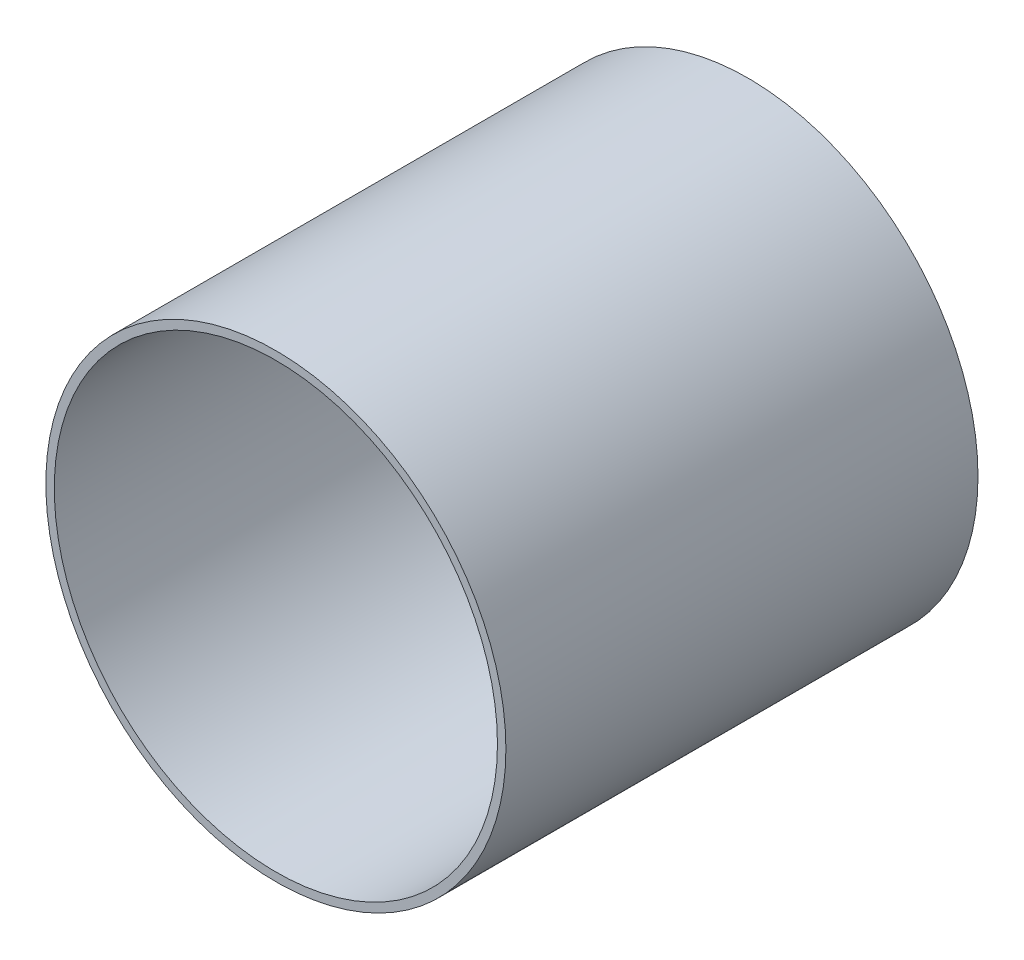
ISO-10303-21;
HEADER;
FILE_DESCRIPTION(('STEP AP214'),'2;1');
FILE_NAME('part.step','',(''),(''),'','','');
FILE_SCHEMA(('AUTOMOTIVE_DESIGN { 1 0 10303 214 1 1 1 1 }'));
ENDSEC;
DATA;
#1=APPLICATION_CONTEXT('core data for automotive mechanical design processes');
#2=APPLICATION_PROTOCOL_DEFINITION('international standard','automotive_design',2000,#1);
#3=PRODUCT_CONTEXT('',#1,'mechanical');
#4=PRODUCT('Part','Part','',(#3));
#5=PRODUCT_RELATED_PRODUCT_CATEGORY('part','',(#4));
#6=PRODUCT_DEFINITION_FORMATION('','',#4);
#7=PRODUCT_DEFINITION_CONTEXT('part definition',#1,'design');
#8=PRODUCT_DEFINITION('design','',#6,#7);
#9=PRODUCT_DEFINITION_SHAPE('','',#8);
#10=(LENGTH_UNIT() NAMED_UNIT(*) SI_UNIT(.MILLI.,.METRE.));
#11=(NAMED_UNIT(*) PLANE_ANGLE_UNIT() SI_UNIT($,.RADIAN.));
#12=(NAMED_UNIT(*) SI_UNIT($,.STERADIAN.) SOLID_ANGLE_UNIT());
#13=UNCERTAINTY_MEASURE_WITH_UNIT(LENGTH_MEASURE(1.E-05),#10,'distance_accuracy_value','');
#14=(GEOMETRIC_REPRESENTATION_CONTEXT(3) GLOBAL_UNCERTAINTY_ASSIGNED_CONTEXT((#13)) GLOBAL_UNIT_ASSIGNED_CONTEXT((#10,
#11,#12)) REPRESENTATION_CONTEXT('',''));
#15=CARTESIAN_POINT('',(0.,0.,0.));
#16=DIRECTION('',(0.,0.,1.));
#17=DIRECTION('',(1.,0.,0.));
#18=AXIS2_PLACEMENT_3D('',#15,#16,#17);
#19=CARTESIAN_POINT('',(0.,0.,101.6));
#20=DIRECTION('',(0.,0.,1.));
#21=DIRECTION('',(1.,0.,0.));
#22=AXIS2_PLACEMENT_3D('',#19,#20,#21);
#23=PLANE('',#22);
#24=CARTESIAN_POINT('',(0.,0.,101.6));
#25=DIRECTION('',(0.,0.,1.));
#26=DIRECTION('',(1.,0.,0.));
#27=AXIS2_PLACEMENT_3D('',#24,#25,#26);
#28=CIRCLE('',#27,49.5046);
#29=CARTESIAN_POINT('',(49.5046,0.,101.6));
#30=VERTEX_POINT('',#29);
#31=EDGE_CURVE('E10',#30,#30,#28,.T.);
#32=ORIENTED_EDGE('',*,*,#31,.T.);
#33=EDGE_LOOP('',(#32));
#34=FACE_BOUND('',#33,.T.);
#35=CARTESIAN_POINT('',(0.,0.,101.6));
#36=DIRECTION('',(0.,0.,1.));
#37=DIRECTION('',(1.,0.,0.));
#38=AXIS2_PLACEMENT_3D('',#35,#36,#37);
#39=CIRCLE('',#38,47.6885);
#40=CARTESIAN_POINT('',(47.6885,0.,101.6));
#41=VERTEX_POINT('',#40);
#42=EDGE_CURVE('E59',#41,#41,#39,.T.);
#43=ORIENTED_EDGE('',*,*,#42,.F.);
#44=EDGE_LOOP('',(#43));
#45=FACE_BOUND('',#44,.T.);
#46=ADVANCED_FACE('F44',(#34,#45),#23,.T.);
#47=CARTESIAN_POINT('',(0.,0.,0.));
#48=DIRECTION('',(0.,0.,1.));
#49=DIRECTION('',(1.,0.,0.));
#50=AXIS2_PLACEMENT_3D('',#47,#48,#49);
#51=PLANE('',#50);
#52=CARTESIAN_POINT('',(0.,0.,0.));
#53=DIRECTION('',(0.,0.,1.));
#54=DIRECTION('',(1.,0.,0.));
#55=AXIS2_PLACEMENT_3D('',#52,#53,#54);
#56=CIRCLE('',#55,49.5046);
#57=CARTESIAN_POINT('',(49.5046,0.,0.));
#58=VERTEX_POINT('',#57);
#59=EDGE_CURVE('E47',#58,#58,#56,.T.);
#60=ORIENTED_EDGE('',*,*,#59,.F.);
#61=EDGE_LOOP('',(#60));
#62=FACE_BOUND('',#61,.T.);
#63=CARTESIAN_POINT('',(0.,0.,0.));
#64=DIRECTION('',(0.,0.,1.));
#65=DIRECTION('',(1.,0.,0.));
#66=AXIS2_PLACEMENT_3D('',#63,#64,#65);
#67=CIRCLE('',#66,47.6885);
#68=CARTESIAN_POINT('',(47.6885,0.,0.));
#69=VERTEX_POINT('',#68);
#70=EDGE_CURVE('E58',#69,#69,#67,.T.);
#71=ORIENTED_EDGE('',*,*,#70,.T.);
#72=EDGE_LOOP('',(#71));
#73=FACE_BOUND('',#72,.T.);
#74=ADVANCED_FACE('F72',(#62,#73),#51,.F.);
#75=CARTESIAN_POINT('',(0.,0.,101.6));
#76=DIRECTION('',(0.,0.,-1.));
#77=DIRECTION('',(-1.,0.,0.));
#78=AXIS2_PLACEMENT_3D('',#75,#76,#77);
#79=CYLINDRICAL_SURFACE('',#78,49.5046);
#80=ORIENTED_EDGE('',*,*,#31,.F.);
#81=EDGE_LOOP('',(#80));
#82=FACE_BOUND('',#81,.T.);
#83=ORIENTED_EDGE('',*,*,#59,.T.);
#84=EDGE_LOOP('',(#83));
#85=FACE_BOUND('',#84,.T.);
#86=ADVANCED_FACE('F50',(#82,#85),#79,.T.);
#87=CARTESIAN_POINT('',(0.,0.,101.6));
#88=DIRECTION('',(0.,0.,-1.));
#89=DIRECTION('',(-1.,0.,0.));
#90=AXIS2_PLACEMENT_3D('',#87,#88,#89);
#91=CYLINDRICAL_SURFACE('',#90,47.6885);
#92=ORIENTED_EDGE('',*,*,#42,.T.);
#93=EDGE_LOOP('',(#92));
#94=FACE_BOUND('',#93,.T.);
#95=ORIENTED_EDGE('',*,*,#70,.F.);
#96=EDGE_LOOP('',(#95));
#97=FACE_BOUND('',#96,.T.);
#98=ADVANCED_FACE('F66',(#94,#97),#91,.F.);
#99=CLOSED_SHELL('',(#46,#74,#86,#98));
#100=MANIFOLD_SOLID_BREP('B2',#99);
#101=ADVANCED_BREP_SHAPE_REPRESENTATION('',(#18,#100),#14);
#102=SHAPE_DEFINITION_REPRESENTATION(#9,#101);
ENDSEC;
END-ISO-10303-21;
